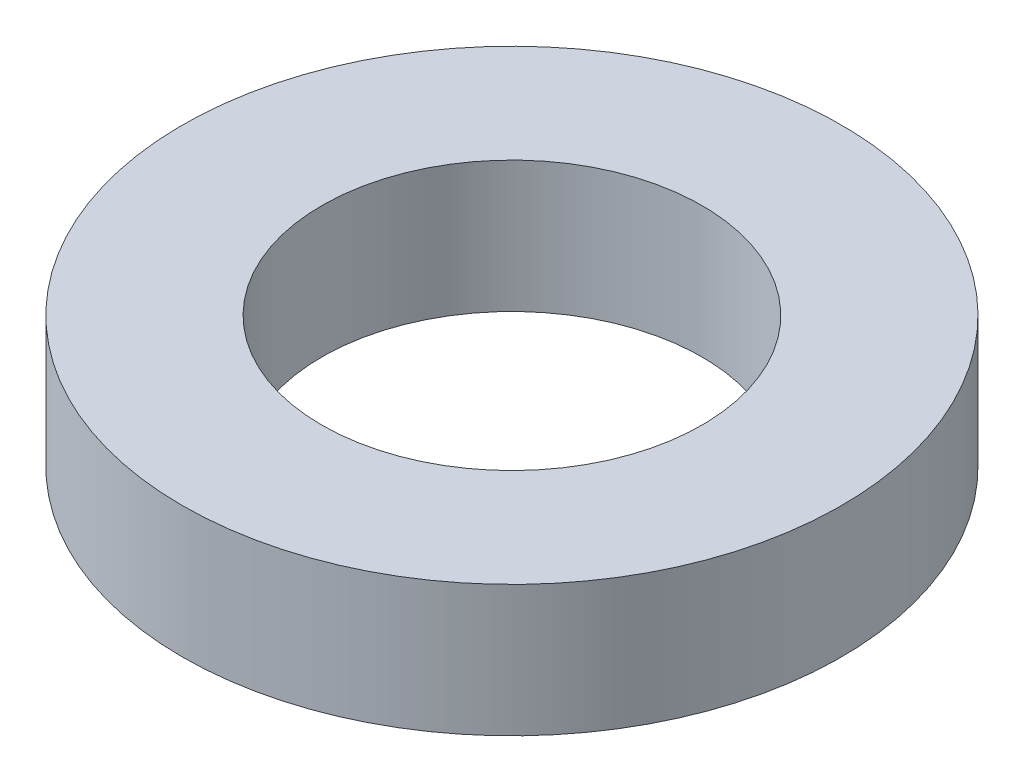
ISO-10303-21;
HEADER;
FILE_DESCRIPTION(('STEP AP214'),'2;1');
FILE_NAME('part.step','',(''),(''),'','','');
FILE_SCHEMA(('AUTOMOTIVE_DESIGN { 1 0 10303 214 1 1 1 1 }'));
ENDSEC;
DATA;
#1=APPLICATION_CONTEXT('core data for automotive mechanical design processes');
#2=APPLICATION_PROTOCOL_DEFINITION('international standard','automotive_design',2000,#1);
#3=PRODUCT_CONTEXT('',#1,'mechanical');
#4=PRODUCT('Part','Part','',(#3));
#5=PRODUCT_RELATED_PRODUCT_CATEGORY('part','',(#4));
#6=PRODUCT_DEFINITION_FORMATION('','',#4);
#7=PRODUCT_DEFINITION_CONTEXT('part definition',#1,'design');
#8=PRODUCT_DEFINITION('design','',#6,#7);
#9=PRODUCT_DEFINITION_SHAPE('','',#8);
#10=(LENGTH_UNIT() NAMED_UNIT(*) SI_UNIT(.MILLI.,.METRE.));
#11=(NAMED_UNIT(*) PLANE_ANGLE_UNIT() SI_UNIT($,.RADIAN.));
#12=(NAMED_UNIT(*) SI_UNIT($,.STERADIAN.) SOLID_ANGLE_UNIT());
#13=UNCERTAINTY_MEASURE_WITH_UNIT(LENGTH_MEASURE(1.E-05),#10,'distance_accuracy_value','');
#14=(GEOMETRIC_REPRESENTATION_CONTEXT(3) GLOBAL_UNCERTAINTY_ASSIGNED_CONTEXT((#13)) GLOBAL_UNIT_ASSIGNED_CONTEXT((#10,
#11,#12)) REPRESENTATION_CONTEXT('',''));
#15=CARTESIAN_POINT('',(0.,0.,0.));
#16=DIRECTION('',(0.,0.,1.));
#17=DIRECTION('',(1.,0.,0.));
#18=AXIS2_PLACEMENT_3D('',#15,#16,#17);
#19=CARTESIAN_POINT('',(0.,6.57,0.));
#20=DIRECTION('',(0.,1.,0.));
#21=DIRECTION('',(0.,0.,1.));
#22=AXIS2_PLACEMENT_3D('',#19,#20,#21);
#23=PLANE('',#22);
#24=CARTESIAN_POINT('',(0.,6.57,0.));
#25=DIRECTION('',(0.,1.,0.));
#26=DIRECTION('',(0.,0.,1.));
#27=AXIS2_PLACEMENT_3D('',#24,#25,#26);
#28=CIRCLE('',#27,16.51);
#29=CARTESIAN_POINT('',(0.,6.57,16.51));
#30=VERTEX_POINT('',#29);
#31=EDGE_CURVE('E10',#30,#30,#28,.T.);
#32=ORIENTED_EDGE('',*,*,#31,.T.);
#33=EDGE_LOOP('',(#32));
#34=FACE_BOUND('',#33,.T.);
#35=CARTESIAN_POINT('',(0.,6.57,0.));
#36=DIRECTION('',(0.,1.,0.));
#37=DIRECTION('',(0.,0.,1.));
#38=AXIS2_PLACEMENT_3D('',#35,#36,#37);
#39=CIRCLE('',#38,9.525);
#40=CARTESIAN_POINT('',(0.,6.57,9.525));
#41=VERTEX_POINT('',#40);
#42=EDGE_CURVE('E42',#41,#41,#39,.T.);
#43=ORIENTED_EDGE('',*,*,#42,.F.);
#44=EDGE_LOOP('',(#43));
#45=FACE_BOUND('',#44,.T.);
#46=ADVANCED_FACE('F31',(#34,#45),#23,.T.);
#47=CARTESIAN_POINT('',(0.,0.,0.));
#48=DIRECTION('',(0.,1.,0.));
#49=DIRECTION('',(0.,0.,1.));
#50=AXIS2_PLACEMENT_3D('',#47,#48,#49);
#51=PLANE('',#50);
#52=CARTESIAN_POINT('',(0.,0.,0.));
#53=DIRECTION('',(0.,1.,0.));
#54=DIRECTION('',(0.,0.,1.));
#55=AXIS2_PLACEMENT_3D('',#52,#53,#54);
#56=CIRCLE('',#55,16.51);
#57=CARTESIAN_POINT('',(0.,0.,16.51));
#58=VERTEX_POINT('',#57);
#59=EDGE_CURVE('E35',#58,#58,#56,.T.);
#60=ORIENTED_EDGE('',*,*,#59,.F.);
#61=EDGE_LOOP('',(#60));
#62=FACE_BOUND('',#61,.T.);
#63=CARTESIAN_POINT('',(0.,0.,0.));
#64=DIRECTION('',(0.,1.,0.));
#65=DIRECTION('',(0.,0.,1.));
#66=AXIS2_PLACEMENT_3D('',#63,#64,#65);
#67=CIRCLE('',#66,9.525);
#68=CARTESIAN_POINT('',(0.,0.,9.525));
#69=VERTEX_POINT('',#68);
#70=EDGE_CURVE('E44',#69,#69,#67,.T.);
#71=ORIENTED_EDGE('',*,*,#70,.T.);
#72=EDGE_LOOP('',(#71));
#73=FACE_BOUND('',#72,.T.);
#74=ADVANCED_FACE('F54',(#62,#73),#51,.F.);
#75=CARTESIAN_POINT('',(0.,6.57,0.));
#76=DIRECTION('',(0.,-1.,0.));
#77=DIRECTION('',(0.,0.,-1.));
#78=AXIS2_PLACEMENT_3D('',#75,#76,#77);
#79=CYLINDRICAL_SURFACE('',#78,16.51);
#80=ORIENTED_EDGE('',*,*,#31,.F.);
#81=EDGE_LOOP('',(#80));
#82=FACE_BOUND('',#81,.T.);
#83=ORIENTED_EDGE('',*,*,#59,.T.);
#84=EDGE_LOOP('',(#83));
#85=FACE_BOUND('',#84,.T.);
#86=ADVANCED_FACE('F33',(#82,#85),#79,.T.);
#87=CARTESIAN_POINT('',(0.,6.57,0.));
#88=DIRECTION('',(0.,-1.,0.));
#89=DIRECTION('',(0.,0.,-1.));
#90=AXIS2_PLACEMENT_3D('',#87,#88,#89);
#91=CYLINDRICAL_SURFACE('',#90,9.525);
#92=ORIENTED_EDGE('',*,*,#42,.T.);
#93=EDGE_LOOP('',(#92));
#94=FACE_BOUND('',#93,.T.);
#95=ORIENTED_EDGE('',*,*,#70,.F.);
#96=EDGE_LOOP('',(#95));
#97=FACE_BOUND('',#96,.T.);
#98=ADVANCED_FACE('F50',(#94,#97),#91,.F.);
#99=CLOSED_SHELL('',(#46,#74,#86,#98));
#100=MANIFOLD_SOLID_BREP('B2',#99);
#101=ADVANCED_BREP_SHAPE_REPRESENTATION('',(#18,#100),#14);
#102=SHAPE_DEFINITION_REPRESENTATION(#9,#101);
ENDSEC;
END-ISO-10303-21;
